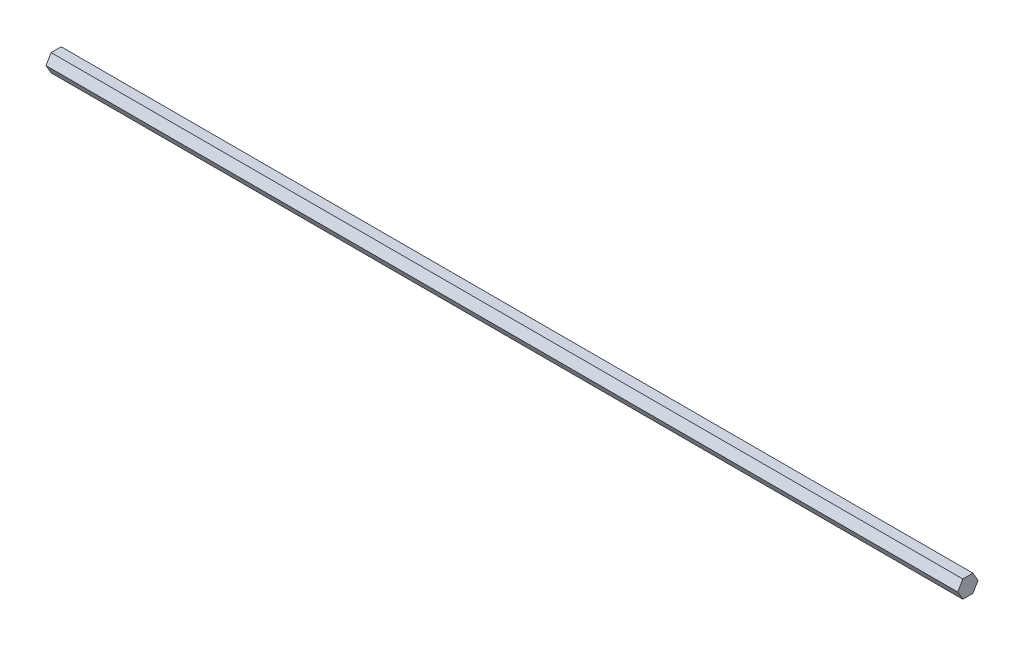
ISO-10303-21;
HEADER;
FILE_DESCRIPTION(('STEP AP214'),'2;1');
FILE_NAME('part.step','',(''),(''),'','','');
FILE_SCHEMA(('AUTOMOTIVE_DESIGN { 1 0 10303 214 1 1 1 1 }'));
ENDSEC;
DATA;
#1=APPLICATION_CONTEXT('core data for automotive mechanical design processes');
#2=APPLICATION_PROTOCOL_DEFINITION('international standard','automotive_design',2000,#1);
#3=PRODUCT_CONTEXT('',#1,'mechanical');
#4=PRODUCT('Part','Part','',(#3));
#5=PRODUCT_RELATED_PRODUCT_CATEGORY('part','',(#4));
#6=PRODUCT_DEFINITION_FORMATION('','',#4);
#7=PRODUCT_DEFINITION_CONTEXT('part definition',#1,'design');
#8=PRODUCT_DEFINITION('design','',#6,#7);
#9=PRODUCT_DEFINITION_SHAPE('','',#8);
#10=(LENGTH_UNIT() NAMED_UNIT(*) SI_UNIT(.MILLI.,.METRE.));
#11=(NAMED_UNIT(*) PLANE_ANGLE_UNIT() SI_UNIT($,.RADIAN.));
#12=(NAMED_UNIT(*) SI_UNIT($,.STERADIAN.) SOLID_ANGLE_UNIT());
#13=UNCERTAINTY_MEASURE_WITH_UNIT(LENGTH_MEASURE(1.E-05),#10,'distance_accuracy_value','');
#14=(GEOMETRIC_REPRESENTATION_CONTEXT(3) GLOBAL_UNCERTAINTY_ASSIGNED_CONTEXT((#13)) GLOBAL_UNIT_ASSIGNED_CONTEXT((#10,
#11,#12)) REPRESENTATION_CONTEXT('',''));
#15=CARTESIAN_POINT('',(0.,0.,0.));
#16=DIRECTION('',(0.,0.,1.));
#17=DIRECTION('',(1.,0.,0.));
#18=AXIS2_PLACEMENT_3D('',#15,#16,#17);
#19=CARTESIAN_POINT('',(660.,-6.34999999999995,-3.66617420935419));
#20=DIRECTION('',(0.,0.499999999999995,0.866025403784442));
#21=DIRECTION('',(0.,-0.866025403784442,0.499999999999995));
#22=AXIS2_PLACEMENT_3D('',#19,#20,#21);
#23=PLANE('',#22);
#24=DIRECTION('',(0.,0.866025403784442,-0.499999999999995));
#25=VECTOR('',#24,1.);
#26=CARTESIAN_POINT('',(0.,-6.34999999999995,-3.66617420935419));
#27=LINE('',#26,#25);
#28=CARTESIAN_POINT('',(0.,-6.34999999999995,-3.66617420935419));
#29=VERTEX_POINT('',#28);
#30=CARTESIAN_POINT('',(0.,0.,-7.33234841870824));
#31=VERTEX_POINT('',#30);
#32=EDGE_CURVE('E118',#29,#31,#27,.T.);
#33=ORIENTED_EDGE('',*,*,#32,.T.);
#34=DIRECTION('',(-1.,0.,0.));
#35=VECTOR('',#34,1.);
#36=CARTESIAN_POINT('',(660.,0.,-7.33234841870824));
#37=LINE('',#36,#35);
#38=CARTESIAN_POINT('',(660.,0.,-7.33234841870824));
#39=VERTEX_POINT('',#38);
#40=EDGE_CURVE('E11',#39,#31,#37,.T.);
#41=ORIENTED_EDGE('',*,*,#40,.F.);
#42=DIRECTION('',(0.,0.866025403784442,-0.499999999999995));
#43=VECTOR('',#42,1.);
#44=CARTESIAN_POINT('',(660.,-6.34999999999995,-3.66617420935419));
#45=LINE('',#44,#43);
#46=CARTESIAN_POINT('',(660.,-6.34999999999995,-3.66617420935419));
#47=VERTEX_POINT('',#46);
#48=EDGE_CURVE('E128',#47,#39,#45,.T.);
#49=ORIENTED_EDGE('',*,*,#48,.F.);
#50=DIRECTION('',(-1.,0.,0.));
#51=VECTOR('',#50,1.);
#52=CARTESIAN_POINT('',(660.,-6.34999999999995,-3.66617420935419));
#53=LINE('',#52,#51);
#54=EDGE_CURVE('E114',#47,#29,#53,.T.);
#55=ORIENTED_EDGE('',*,*,#54,.T.);
#56=EDGE_LOOP('',(#33,#41,#49,#55));
#57=FACE_BOUND('',#56,.T.);
#58=ADVANCED_FACE('F34',(#57),#23,.F.);
#59=CARTESIAN_POINT('',(660.,0.,-7.33234841870824));
#60=DIRECTION('',(0.,-0.500000000000001,0.866025403784438));
#61=DIRECTION('',(0.,-0.866025403784438,-0.500000000000001));
#62=AXIS2_PLACEMENT_3D('',#59,#60,#61);
#63=PLANE('',#62);
#64=DIRECTION('',(0.,0.866025403784438,0.500000000000001));
#65=VECTOR('',#64,1.);
#66=CARTESIAN_POINT('',(0.,0.,-7.33234841870824));
#67=LINE('',#66,#65);
#68=CARTESIAN_POINT('',(0.,6.35,-3.6661742093541));
#69=VERTEX_POINT('',#68);
#70=EDGE_CURVE('E121',#31,#69,#67,.T.);
#71=ORIENTED_EDGE('',*,*,#70,.T.);
#72=DIRECTION('',(-1.,0.,0.));
#73=VECTOR('',#72,1.);
#74=CARTESIAN_POINT('',(660.,6.35,-3.6661742093541));
#75=LINE('',#74,#73);
#76=CARTESIAN_POINT('',(660.,6.35,-3.6661742093541));
#77=VERTEX_POINT('',#76);
#78=EDGE_CURVE('E42',#77,#69,#75,.T.);
#79=ORIENTED_EDGE('',*,*,#78,.F.);
#80=DIRECTION('',(0.,0.866025403784438,0.500000000000001));
#81=VECTOR('',#80,1.);
#82=CARTESIAN_POINT('',(660.,0.,-7.33234841870824));
#83=LINE('',#82,#81);
#84=EDGE_CURVE('E87',#39,#77,#83,.T.);
#85=ORIENTED_EDGE('',*,*,#84,.F.);
#86=ORIENTED_EDGE('',*,*,#40,.T.);
#87=EDGE_LOOP('',(#71,#79,#85,#86));
#88=FACE_BOUND('',#87,.T.);
#89=ADVANCED_FACE('F152',(#88),#63,.F.);
#90=CARTESIAN_POINT('',(660.,6.35,-3.6661742093541));
#91=DIRECTION('',(0.,-1.,0.));
#92=DIRECTION('',(0.,0.,-1.));
#93=AXIS2_PLACEMENT_3D('',#90,#91,#92);
#94=PLANE('',#93);
#95=DIRECTION('',(0.,0.,1.));
#96=VECTOR('',#95,1.);
#97=CARTESIAN_POINT('',(0.,6.35,-3.6661742093541));
#98=LINE('',#97,#96);
#99=CARTESIAN_POINT('',(0.,6.34999999999997,3.66617420935415));
#100=VERTEX_POINT('',#99);
#101=EDGE_CURVE('E123',#69,#100,#98,.T.);
#102=ORIENTED_EDGE('',*,*,#101,.T.);
#103=DIRECTION('',(-1.,0.,0.));
#104=VECTOR('',#103,1.);
#105=CARTESIAN_POINT('',(660.,6.34999999999997,3.66617420935415));
#106=LINE('',#105,#104);
#107=CARTESIAN_POINT('',(660.,6.34999999999997,3.66617420935415));
#108=VERTEX_POINT('',#107);
#109=EDGE_CURVE('E109',#108,#100,#106,.T.);
#110=ORIENTED_EDGE('',*,*,#109,.F.);
#111=DIRECTION('',(0.,0.,1.));
#112=VECTOR('',#111,1.);
#113=CARTESIAN_POINT('',(660.,6.35,-3.6661742093541));
#114=LINE('',#113,#112);
#115=EDGE_CURVE('E100',#77,#108,#114,.T.);
#116=ORIENTED_EDGE('',*,*,#115,.F.);
#117=ORIENTED_EDGE('',*,*,#78,.T.);
#118=EDGE_LOOP('',(#102,#110,#116,#117));
#119=FACE_BOUND('',#118,.T.);
#120=ADVANCED_FACE('F134',(#119),#94,.F.);
#121=CARTESIAN_POINT('',(660.,6.34999999999997,3.66617420935415));
#122=DIRECTION('',(0.,-0.499999999999995,-0.866025403784442));
#123=DIRECTION('',(0.,0.866025403784442,-0.499999999999995));
#124=AXIS2_PLACEMENT_3D('',#121,#122,#123);
#125=PLANE('',#124);
#126=DIRECTION('',(0.,-0.866025403784442,0.499999999999995));
#127=VECTOR('',#126,1.);
#128=CARTESIAN_POINT('',(0.,6.34999999999997,3.66617420935415));
#129=LINE('',#128,#127);
#130=CARTESIAN_POINT('',(0.,0.,7.33234841870823));
#131=VERTEX_POINT('',#130);
#132=EDGE_CURVE('E108',#100,#131,#129,.T.);
#133=ORIENTED_EDGE('',*,*,#132,.T.);
#134=DIRECTION('',(-1.,0.,0.));
#135=VECTOR('',#134,1.);
#136=CARTESIAN_POINT('',(660.,0.,7.33234841870823));
#137=LINE('',#136,#135);
#138=CARTESIAN_POINT('',(660.,0.,7.33234841870823));
#139=VERTEX_POINT('',#138);
#140=EDGE_CURVE('E105',#139,#131,#137,.T.);
#141=ORIENTED_EDGE('',*,*,#140,.F.);
#142=DIRECTION('',(0.,-0.866025403784442,0.499999999999995));
#143=VECTOR('',#142,1.);
#144=CARTESIAN_POINT('',(660.,6.34999999999997,3.66617420935415));
#145=LINE('',#144,#143);
#146=EDGE_CURVE('E94',#108,#139,#145,.T.);
#147=ORIENTED_EDGE('',*,*,#146,.F.);
#148=ORIENTED_EDGE('',*,*,#109,.T.);
#149=EDGE_LOOP('',(#133,#141,#147,#148));
#150=FACE_BOUND('',#149,.T.);
#151=ADVANCED_FACE('F106',(#150),#125,.F.);
#152=CARTESIAN_POINT('',(660.,0.,7.33234841870823));
#153=DIRECTION('',(0.,0.500000000000007,-0.866025403784435));
#154=DIRECTION('',(0.,0.866025403784435,0.500000000000007));
#155=AXIS2_PLACEMENT_3D('',#152,#153,#154);
#156=PLANE('',#155);
#157=DIRECTION('',(0.,-0.866025403784435,-0.500000000000007));
#158=VECTOR('',#157,1.);
#159=CARTESIAN_POINT('',(0.,0.,7.33234841870823));
#160=LINE('',#159,#158);
#161=CARTESIAN_POINT('',(0.,-6.35000000000002,3.66617420935406));
#162=VERTEX_POINT('',#161);
#163=EDGE_CURVE('E73',#131,#162,#160,.T.);
#164=ORIENTED_EDGE('',*,*,#163,.T.);
#165=DIRECTION('',(-1.,0.,0.));
#166=VECTOR('',#165,1.);
#167=CARTESIAN_POINT('',(660.,-6.35000000000002,3.66617420935406));
#168=LINE('',#167,#166);
#169=CARTESIAN_POINT('',(660.,-6.35000000000002,3.66617420935406));
#170=VERTEX_POINT('',#169);
#171=EDGE_CURVE('E110',#170,#162,#168,.T.);
#172=ORIENTED_EDGE('',*,*,#171,.F.);
#173=DIRECTION('',(0.,-0.866025403784435,-0.500000000000007));
#174=VECTOR('',#173,1.);
#175=CARTESIAN_POINT('',(660.,0.,7.33234841870823));
#176=LINE('',#175,#174);
#177=EDGE_CURVE('E98',#139,#170,#176,.T.);
#178=ORIENTED_EDGE('',*,*,#177,.F.);
#179=ORIENTED_EDGE('',*,*,#140,.T.);
#180=EDGE_LOOP('',(#164,#172,#178,#179));
#181=FACE_BOUND('',#180,.T.);
#182=ADVANCED_FACE('F112',(#181),#156,.F.);
#183=CARTESIAN_POINT('',(660.,-6.35000000000002,3.66617420935406));
#184=DIRECTION('',(0.,1.,0.));
#185=DIRECTION('',(0.,0.,1.));
#186=AXIS2_PLACEMENT_3D('',#183,#184,#185);
#187=PLANE('',#186);
#188=DIRECTION('',(0.,0.,-1.));
#189=VECTOR('',#188,1.);
#190=CARTESIAN_POINT('',(0.,-6.35000000000002,3.66617420935406));
#191=LINE('',#190,#189);
#192=EDGE_CURVE('E79',#162,#29,#191,.T.);
#193=ORIENTED_EDGE('',*,*,#192,.T.);
#194=ORIENTED_EDGE('',*,*,#54,.F.);
#195=DIRECTION('',(0.,0.,-1.));
#196=VECTOR('',#195,1.);
#197=CARTESIAN_POINT('',(660.,-6.35000000000002,3.66617420935406));
#198=LINE('',#197,#196);
#199=EDGE_CURVE('E50',#170,#47,#198,.T.);
#200=ORIENTED_EDGE('',*,*,#199,.F.);
#201=ORIENTED_EDGE('',*,*,#171,.T.);
#202=EDGE_LOOP('',(#193,#194,#200,#201));
#203=FACE_BOUND('',#202,.T.);
#204=ADVANCED_FACE('F141',(#203),#187,.F.);
#205=CARTESIAN_POINT('',(660.,0.,0.));
#206=DIRECTION('',(1.,0.,0.));
#207=DIRECTION('',(0.,0.,-1.));
#208=AXIS2_PLACEMENT_3D('',#205,#206,#207);
#209=PLANE('',#208);
#210=ORIENTED_EDGE('',*,*,#48,.T.);
#211=ORIENTED_EDGE('',*,*,#84,.T.);
#212=ORIENTED_EDGE('',*,*,#115,.T.);
#213=ORIENTED_EDGE('',*,*,#146,.T.);
#214=ORIENTED_EDGE('',*,*,#177,.T.);
#215=ORIENTED_EDGE('',*,*,#199,.T.);
#216=EDGE_LOOP('',(#210,#211,#212,#213,#214,#215));
#217=FACE_BOUND('',#216,.T.);
#218=ADVANCED_FACE('F96',(#217),#209,.T.);
#219=CARTESIAN_POINT('',(0.,0.,0.));
#220=DIRECTION('',(1.,0.,0.));
#221=DIRECTION('',(0.,0.,-1.));
#222=AXIS2_PLACEMENT_3D('',#219,#220,#221);
#223=PLANE('',#222);
#224=ORIENTED_EDGE('',*,*,#32,.F.);
#225=ORIENTED_EDGE('',*,*,#192,.F.);
#226=ORIENTED_EDGE('',*,*,#163,.F.);
#227=ORIENTED_EDGE('',*,*,#132,.F.);
#228=ORIENTED_EDGE('',*,*,#101,.F.);
#229=ORIENTED_EDGE('',*,*,#70,.F.);
#230=EDGE_LOOP('',(#224,#225,#226,#227,#228,#229));
#231=FACE_BOUND('',#230,.T.);
#232=ADVANCED_FACE('F137',(#231),#223,.F.);
#233=CLOSED_SHELL('',(#58,#89,#120,#151,#182,#204,#218,#232));
#234=MANIFOLD_SOLID_BREP('B2',#233);
#235=ADVANCED_BREP_SHAPE_REPRESENTATION('',(#18,#234),#14);
#236=SHAPE_DEFINITION_REPRESENTATION(#9,#235);
ENDSEC;
END-ISO-10303-21;
